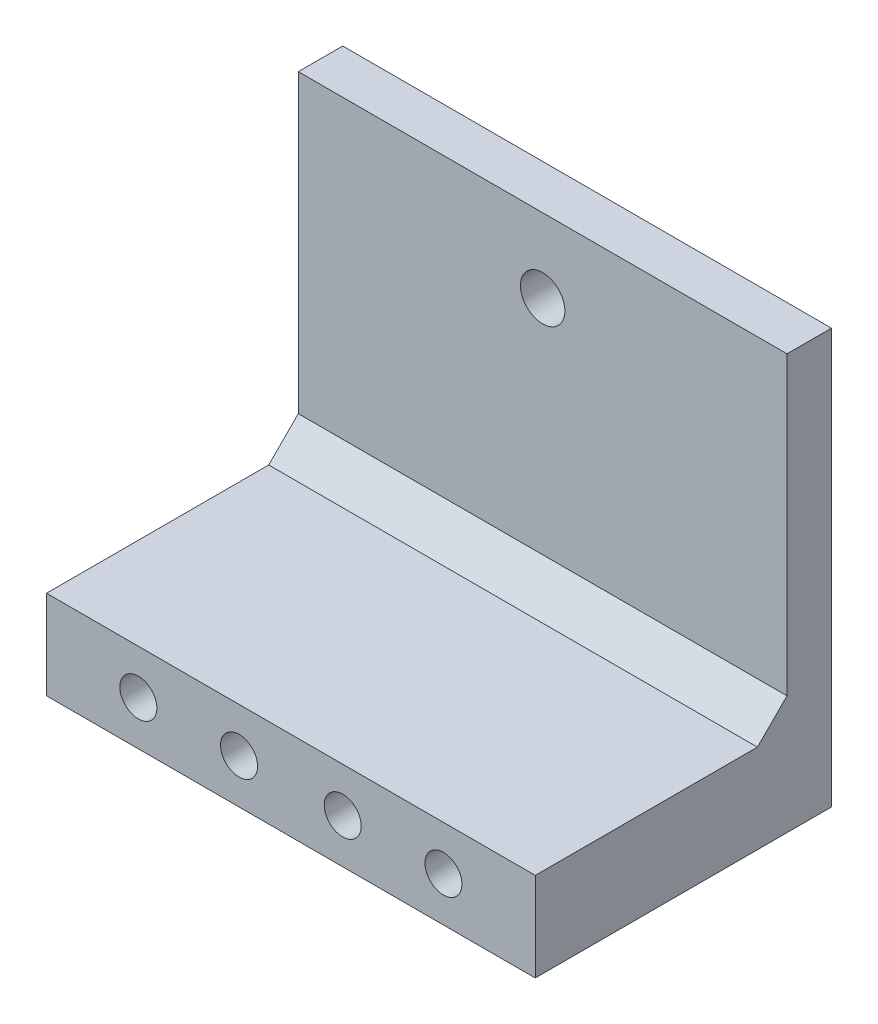
ISO-10303-21;
HEADER;
FILE_DESCRIPTION(('STEP AP214'),'2;1');
FILE_NAME('part.step','',(''),(''),'','','');
FILE_SCHEMA(('AUTOMOTIVE_DESIGN { 1 0 10303 214 1 1 1 1 }'));
ENDSEC;
DATA;
#1=APPLICATION_CONTEXT('core data for automotive mechanical design processes');
#2=APPLICATION_PROTOCOL_DEFINITION('international standard','automotive_design',2000,#1);
#3=PRODUCT_CONTEXT('',#1,'mechanical');
#4=PRODUCT('Part','Part','',(#3));
#5=PRODUCT_RELATED_PRODUCT_CATEGORY('part','',(#4));
#6=PRODUCT_DEFINITION_FORMATION('','',#4);
#7=PRODUCT_DEFINITION_CONTEXT('part definition',#1,'design');
#8=PRODUCT_DEFINITION('design','',#6,#7);
#9=PRODUCT_DEFINITION_SHAPE('','',#8);
#10=(LENGTH_UNIT() NAMED_UNIT(*) SI_UNIT(.MILLI.,.METRE.));
#11=(NAMED_UNIT(*) PLANE_ANGLE_UNIT() SI_UNIT($,.RADIAN.));
#12=(NAMED_UNIT(*) SI_UNIT($,.STERADIAN.) SOLID_ANGLE_UNIT());
#13=UNCERTAINTY_MEASURE_WITH_UNIT(LENGTH_MEASURE(1.E-05),#10,'distance_accuracy_value','');
#14=(GEOMETRIC_REPRESENTATION_CONTEXT(3) GLOBAL_UNCERTAINTY_ASSIGNED_CONTEXT((#13)) GLOBAL_UNIT_ASSIGNED_CONTEXT((#10,
#11,#12)) REPRESENTATION_CONTEXT('',''));
#15=CARTESIAN_POINT('',(0.,0.,0.));
#16=DIRECTION('',(0.,0.,1.));
#17=DIRECTION('',(1.,0.,0.));
#18=AXIS2_PLACEMENT_3D('',#15,#16,#17);
#19=CARTESIAN_POINT('',(0.,32.669809041861,-21.));
#20=DIRECTION('',(0.,-0.707106781186551,-0.707106781186544));
#21=DIRECTION('',(0.,0.707106781186544,-0.707106781186551));
#22=AXIS2_PLACEMENT_3D('',#19,#20,#21);
#23=PLANE('',#22);
#24=DIRECTION('',(-1.,0.,0.));
#25=VECTOR('',#24,1.);
#26=CARTESIAN_POINT('',(0.,32.669809041861,-21.));
#27=LINE('',#26,#25);
#28=CARTESIAN_POINT('',(-6.41211280138837,32.669809041861,-21.));
#29=VERTEX_POINT('',#28);
#30=CARTESIAN_POINT('',(-39.4121128013917,32.669809041861,-21.));
#31=VERTEX_POINT('',#30);
#32=EDGE_CURVE('E11',#29,#31,#27,.T.);
#33=ORIENTED_EDGE('',*,*,#32,.F.);
#34=DIRECTION('',(0.,0.707106781182111,-0.707106781190984));
#35=VECTOR('',#34,1.);
#36=CARTESIAN_POINT('',(-6.41211280139165,32.669809041861,-21.));
#37=LINE('',#36,#35);
#38=CARTESIAN_POINT('',(-6.41211280139165,34.669809041836,-23.));
#39=VERTEX_POINT('',#38);
#40=EDGE_CURVE('E171',#29,#39,#37,.T.);
#41=ORIENTED_EDGE('',*,*,#40,.T.);
#42=DIRECTION('',(1.,0.,0.));
#43=VECTOR('',#42,1.);
#44=CARTESIAN_POINT('',(0.,34.6698090418611,-23.));
#45=LINE('',#44,#43);
#46=CARTESIAN_POINT('',(-39.4121128013153,34.669809041836,-23.));
#47=VERTEX_POINT('',#46);
#48=EDGE_CURVE('E160',#47,#39,#45,.T.);
#49=ORIENTED_EDGE('',*,*,#48,.F.);
#50=DIRECTION('',(0.,0.707106781182111,-0.707106781190984));
#51=VECTOR('',#50,1.);
#52=CARTESIAN_POINT('',(-39.4121128013917,32.669809041861,-21.));
#53=LINE('',#52,#51);
#54=EDGE_CURVE('E133',#31,#47,#53,.T.);
#55=ORIENTED_EDGE('',*,*,#54,.F.);
#56=EDGE_LOOP('',(#33,#41,#49,#55));
#57=FACE_BOUND('',#56,.T.);
#58=ADVANCED_FACE('F17',(#57),#23,.F.);
#59=CARTESIAN_POINT('',(0.,32.669809041861,0.));
#60=DIRECTION('',(0.,1.,0.));
#61=DIRECTION('',(1.,0.,0.));
#62=AXIS2_PLACEMENT_3D('',#59,#60,#61);
#63=PLANE('',#62);
#64=ORIENTED_EDGE('',*,*,#32,.T.);
#65=DIRECTION('',(0.,0.,1.));
#66=VECTOR('',#65,1.);
#67=CARTESIAN_POINT('',(-39.4121128013917,32.669809041861,-25.));
#68=LINE('',#67,#66);
#69=CARTESIAN_POINT('',(-39.4121128013917,32.669809041861,-6.));
#70=VERTEX_POINT('',#69);
#71=EDGE_CURVE('E152',#31,#70,#68,.T.);
#72=ORIENTED_EDGE('',*,*,#71,.T.);
#73=DIRECTION('',(1.,0.,0.));
#74=VECTOR('',#73,1.);
#75=CARTESIAN_POINT('',(-39.4121128013917,32.669809041861,-6.));
#76=LINE('',#75,#74);
#77=CARTESIAN_POINT('',(-6.41211280138837,32.669809041861,-6.));
#78=VERTEX_POINT('',#77);
#79=EDGE_CURVE('E26',#70,#78,#76,.T.);
#80=ORIENTED_EDGE('',*,*,#79,.T.);
#81=DIRECTION('',(0.,0.,1.));
#82=VECTOR('',#81,1.);
#83=CARTESIAN_POINT('',(-6.41211280138837,32.669809041861,-25.));
#84=LINE('',#83,#82);
#85=EDGE_CURVE('E127',#29,#78,#84,.T.);
#86=ORIENTED_EDGE('',*,*,#85,.F.);
#87=EDGE_LOOP('',(#64,#72,#80,#86));
#88=FACE_BOUND('',#87,.T.);
#89=ADVANCED_FACE('F19',(#88),#63,.T.);
#90=CARTESIAN_POINT('',(-6.41211280139167,-16.8302017820798,-6.));
#91=DIRECTION('',(0.,0.,1.));
#92=DIRECTION('',(0.,-1.,0.));
#93=AXIS2_PLACEMENT_3D('',#90,#91,#92);
#94=PLANE('',#93);
#95=CARTESIAN_POINT('',(-33.2121128013917,29.6698090418937,-6.));
#96=DIRECTION('',(0.,0.,-1.));
#97=DIRECTION('',(0.,-1.,0.));
#98=AXIS2_PLACEMENT_3D('',#95,#96,#97);
#99=CIRCLE('',#98,1.25);
#100=CARTESIAN_POINT('',(-33.2121128013917,28.4198090418937,-6.));
#101=VERTEX_POINT('',#100);
#102=EDGE_CURVE('E185',#101,#101,#99,.T.);
#103=ORIENTED_EDGE('',*,*,#102,.T.);
#104=EDGE_LOOP('',(#103));
#105=FACE_BOUND('',#104,.T.);
#106=CARTESIAN_POINT('',(-12.612112801392,29.6698090418937,-6.));
#107=DIRECTION('',(0.,0.,-1.));
#108=DIRECTION('',(0.,-1.,0.));
#109=AXIS2_PLACEMENT_3D('',#106,#107,#108);
#110=CIRCLE('',#109,1.25);
#111=CARTESIAN_POINT('',(-12.612112801392,28.4198090418937,-6.));
#112=VERTEX_POINT('',#111);
#113=EDGE_CURVE('E195',#112,#112,#110,.T.);
#114=ORIENTED_EDGE('',*,*,#113,.T.);
#115=EDGE_LOOP('',(#114));
#116=FACE_BOUND('',#115,.T.);
#117=CARTESIAN_POINT('',(-26.4121128013917,29.6698090418937,-6.));
#118=DIRECTION('',(0.,0.,-1.));
#119=DIRECTION('',(0.,-1.,0.));
#120=AXIS2_PLACEMENT_3D('',#117,#118,#119);
#121=CIRCLE('',#120,1.25);
#122=CARTESIAN_POINT('',(-26.4121128013917,28.4198090418937,-6.));
#123=VERTEX_POINT('',#122);
#124=EDGE_CURVE('E200',#123,#123,#121,.T.);
#125=ORIENTED_EDGE('',*,*,#124,.T.);
#126=EDGE_LOOP('',(#125));
#127=FACE_BOUND('',#126,.T.);
#128=CARTESIAN_POINT('',(-19.4121128013917,29.6698090418937,-6.));
#129=DIRECTION('',(0.,0.,-1.));
#130=DIRECTION('',(0.,-1.,0.));
#131=AXIS2_PLACEMENT_3D('',#128,#129,#130);
#132=CIRCLE('',#131,1.25);
#133=CARTESIAN_POINT('',(-19.4121128013917,28.4198090418937,-6.));
#134=VERTEX_POINT('',#133);
#135=EDGE_CURVE('E211',#134,#134,#132,.T.);
#136=ORIENTED_EDGE('',*,*,#135,.T.);
#137=EDGE_LOOP('',(#136));
#138=FACE_BOUND('',#137,.T.);
#139=ORIENTED_EDGE('',*,*,#79,.F.);
#140=DIRECTION('',(0.,1.,0.));
#141=VECTOR('',#140,1.);
#142=CARTESIAN_POINT('',(-39.4121128013917,-16.8302017820798,-6.));
#143=LINE('',#142,#141);
#144=CARTESIAN_POINT('',(-39.4121128013917,26.6698090416414,-6.));
#145=VERTEX_POINT('',#144);
#146=EDGE_CURVE('E148',#145,#70,#143,.T.);
#147=ORIENTED_EDGE('',*,*,#146,.F.);
#148=DIRECTION('',(-1.,0.,0.));
#149=VECTOR('',#148,1.);
#150=CARTESIAN_POINT('',(0.,26.6698090416414,-6.));
#151=LINE('',#150,#149);
#152=CARTESIAN_POINT('',(-6.41211280139167,26.6698090416413,-6.));
#153=VERTEX_POINT('',#152);
#154=EDGE_CURVE('E49',#153,#145,#151,.T.);
#155=ORIENTED_EDGE('',*,*,#154,.F.);
#156=DIRECTION('',(0.,1.,0.));
#157=VECTOR('',#156,1.);
#158=CARTESIAN_POINT('',(-6.41211280139167,-16.8302017820798,-6.));
#159=LINE('',#158,#157);
#160=EDGE_CURVE('E121',#153,#78,#159,.T.);
#161=ORIENTED_EDGE('',*,*,#160,.T.);
#162=EDGE_LOOP('',(#139,#147,#155,#161));
#163=FACE_BOUND('',#162,.T.);
#164=ADVANCED_FACE('F169',(#105,#116,#127,#138,#163),#94,.T.);
#165=CARTESIAN_POINT('',(0.,0.,-23.));
#166=DIRECTION('',(0.,0.,-1.));
#167=DIRECTION('',(0.,-1.,0.));
#168=AXIS2_PLACEMENT_3D('',#165,#166,#167);
#169=PLANE('',#168);
#170=CARTESIAN_POINT('',(-22.9121128013917,49.6698090418938,-23.));
#171=DIRECTION('',(0.,0.,1.));
#172=DIRECTION('',(-1.,0.,0.));
#173=AXIS2_PLACEMENT_3D('',#170,#171,#172);
#174=CIRCLE('',#173,1.5);
#175=CARTESIAN_POINT('',(-24.4121128013917,49.6698090418938,-23.));
#176=VERTEX_POINT('',#175);
#177=EDGE_CURVE('E221',#176,#176,#174,.T.);
#178=ORIENTED_EDGE('',*,*,#177,.F.);
#179=EDGE_LOOP('',(#178));
#180=FACE_BOUND('',#179,.T.);
#181=DIRECTION('',(0.,1.,0.));
#182=VECTOR('',#181,1.);
#183=CARTESIAN_POINT('',(-39.4121128013153,31.669809041861,-23.));
#184=LINE('',#183,#182);
#185=CARTESIAN_POINT('',(-39.4121128013153,54.6698090418938,-23.));
#186=VERTEX_POINT('',#185);
#187=EDGE_CURVE('E137',#47,#186,#184,.T.);
#188=ORIENTED_EDGE('',*,*,#187,.F.);
#189=ORIENTED_EDGE('',*,*,#48,.T.);
#190=DIRECTION('',(0.,-1.,0.));
#191=VECTOR('',#190,1.);
#192=CARTESIAN_POINT('',(-6.41211280139167,31.669809041861,-23.));
#193=LINE('',#192,#191);
#194=CARTESIAN_POINT('',(-6.41211280139167,54.6698090418938,-23.));
#195=VERTEX_POINT('',#194);
#196=EDGE_CURVE('E177',#195,#39,#193,.T.);
#197=ORIENTED_EDGE('',*,*,#196,.F.);
#198=DIRECTION('',(1.,0.,0.));
#199=VECTOR('',#198,1.);
#200=CARTESIAN_POINT('',(0.,54.6698090418938,-23.));
#201=LINE('',#200,#199);
#202=EDGE_CURVE('E155',#186,#195,#201,.T.);
#203=ORIENTED_EDGE('',*,*,#202,.F.);
#204=EDGE_LOOP('',(#188,#189,#197,#203));
#205=FACE_BOUND('',#204,.T.);
#206=ADVANCED_FACE('F230',(#180,#205),#169,.F.);
#207=CARTESIAN_POINT('',(0.,54.6698090418938,-23.));
#208=DIRECTION('',(0.,1.,0.));
#209=DIRECTION('',(1.,0.,0.));
#210=AXIS2_PLACEMENT_3D('',#207,#208,#209);
#211=PLANE('',#210);
#212=DIRECTION('',(1.,0.,0.));
#213=VECTOR('',#212,1.);
#214=CARTESIAN_POINT('',(0.,54.6698090418938,-26.));
#215=LINE('',#214,#213);
#216=CARTESIAN_POINT('',(-39.4121128013153,54.6698090418938,-26.));
#217=VERTEX_POINT('',#216);
#218=CARTESIAN_POINT('',(-6.41211280139167,54.6698090418938,-26.));
#219=VERTEX_POINT('',#218);
#220=EDGE_CURVE('E107',#217,#219,#215,.T.);
#221=ORIENTED_EDGE('',*,*,#220,.F.);
#222=DIRECTION('',(0.,0.,-1.));
#223=VECTOR('',#222,1.);
#224=CARTESIAN_POINT('',(-39.4121128013153,54.6698090418938,-23.));
#225=LINE('',#224,#223);
#226=EDGE_CURVE('E141',#186,#217,#225,.T.);
#227=ORIENTED_EDGE('',*,*,#226,.F.);
#228=ORIENTED_EDGE('',*,*,#202,.T.);
#229=DIRECTION('',(0.,0.,-1.));
#230=VECTOR('',#229,1.);
#231=CARTESIAN_POINT('',(-6.41211280139167,54.6698090418938,-23.));
#232=LINE('',#231,#230);
#233=EDGE_CURVE('E116',#195,#219,#232,.T.);
#234=ORIENTED_EDGE('',*,*,#233,.T.);
#235=EDGE_LOOP('',(#221,#227,#228,#234));
#236=FACE_BOUND('',#235,.T.);
#237=ADVANCED_FACE('F233',(#236),#211,.T.);
#238=CARTESIAN_POINT('',(0.,0.,-26.));
#239=DIRECTION('',(0.,0.,1.));
#240=DIRECTION('',(1.,0.,0.));
#241=AXIS2_PLACEMENT_3D('',#238,#239,#240);
#242=PLANE('',#241);
#243=CARTESIAN_POINT('',(-12.612112801392,29.6698090418937,-26.));
#244=DIRECTION('',(0.,0.,-1.));
#245=DIRECTION('',(-1.,0.,0.));
#246=AXIS2_PLACEMENT_3D('',#243,#244,#245);
#247=CIRCLE('',#246,1.25);
#248=CARTESIAN_POINT('',(-13.862112801392,29.6698090418937,-26.));
#249=VERTEX_POINT('',#248);
#250=EDGE_CURVE('E189',#249,#249,#247,.T.);
#251=ORIENTED_EDGE('',*,*,#250,.F.);
#252=EDGE_LOOP('',(#251));
#253=FACE_BOUND('',#252,.T.);
#254=CARTESIAN_POINT('',(-33.2121128013917,29.6698090418937,-26.));
#255=DIRECTION('',(0.,0.,-1.));
#256=DIRECTION('',(-1.,0.,0.));
#257=AXIS2_PLACEMENT_3D('',#254,#255,#256);
#258=CIRCLE('',#257,1.25);
#259=CARTESIAN_POINT('',(-34.4621128013917,29.6698090418937,-26.));
#260=VERTEX_POINT('',#259);
#261=EDGE_CURVE('E181',#260,#260,#258,.T.);
#262=ORIENTED_EDGE('',*,*,#261,.F.);
#263=EDGE_LOOP('',(#262));
#264=FACE_BOUND('',#263,.T.);
#265=CARTESIAN_POINT('',(-22.9121128013917,49.6698090418938,-26.));
#266=DIRECTION('',(0.,0.,-1.));
#267=DIRECTION('',(-1.,0.,0.));
#268=AXIS2_PLACEMENT_3D('',#265,#266,#267);
#269=CIRCLE('',#268,1.5);
#270=CARTESIAN_POINT('',(-24.4121128013917,49.6698090418938,-26.));
#271=VERTEX_POINT('',#270);
#272=EDGE_CURVE('E217',#271,#271,#269,.T.);
#273=ORIENTED_EDGE('',*,*,#272,.F.);
#274=EDGE_LOOP('',(#273));
#275=FACE_BOUND('',#274,.T.);
#276=CARTESIAN_POINT('',(-26.4121128013917,29.6698090418937,-26.));
#277=DIRECTION('',(0.,0.,-1.));
#278=DIRECTION('',(-1.,0.,0.));
#279=AXIS2_PLACEMENT_3D('',#276,#277,#278);
#280=CIRCLE('',#279,1.25);
#281=CARTESIAN_POINT('',(-27.6621128013917,29.6698090418937,-26.));
#282=VERTEX_POINT('',#281);
#283=EDGE_CURVE('E196',#282,#282,#280,.T.);
#284=ORIENTED_EDGE('',*,*,#283,.F.);
#285=EDGE_LOOP('',(#284));
#286=FACE_BOUND('',#285,.T.);
#287=CARTESIAN_POINT('',(-19.4121128013917,29.6698090418937,-26.));
#288=DIRECTION('',(0.,0.,-1.));
#289=DIRECTION('',(-1.,0.,0.));
#290=AXIS2_PLACEMENT_3D('',#287,#288,#289);
#291=CIRCLE('',#290,1.25);
#292=CARTESIAN_POINT('',(-20.6621128013917,29.6698090418937,-26.));
#293=VERTEX_POINT('',#292);
#294=EDGE_CURVE('E204',#293,#293,#291,.T.);
#295=ORIENTED_EDGE('',*,*,#294,.F.);
#296=EDGE_LOOP('',(#295));
#297=FACE_BOUND('',#296,.T.);
#298=DIRECTION('',(0.,1.,0.));
#299=VECTOR('',#298,1.);
#300=CARTESIAN_POINT('',(-6.41211280139167,27.6698090416414,-26.));
#301=LINE('',#300,#299);
#302=CARTESIAN_POINT('',(-6.41211280139167,26.6698090416414,-26.));
#303=VERTEX_POINT('',#302);
#304=EDGE_CURVE('E110',#303,#219,#301,.T.);
#305=ORIENTED_EDGE('',*,*,#304,.F.);
#306=DIRECTION('',(1.,0.,0.));
#307=VECTOR('',#306,1.);
#308=CARTESIAN_POINT('',(0.,26.6698090416414,-26.));
#309=LINE('',#308,#307);
#310=CARTESIAN_POINT('',(-39.4121128013917,26.6698090416414,-26.));
#311=VERTEX_POINT('',#310);
#312=EDGE_CURVE('E95',#311,#303,#309,.T.);
#313=ORIENTED_EDGE('',*,*,#312,.F.);
#314=DIRECTION('',(0.,-1.,0.));
#315=VECTOR('',#314,1.);
#316=CARTESIAN_POINT('',(-39.4121128013917,31.669809041861,-26.));
#317=LINE('',#316,#315);
#318=EDGE_CURVE('E145',#217,#311,#317,.T.);
#319=ORIENTED_EDGE('',*,*,#318,.F.);
#320=ORIENTED_EDGE('',*,*,#220,.T.);
#321=EDGE_LOOP('',(#305,#313,#319,#320));
#322=FACE_BOUND('',#321,.T.);
#323=ADVANCED_FACE('F111',(#253,#264,#275,#286,#297,#322),#242,.F.);
#324=CARTESIAN_POINT('',(0.,26.6698090416414,0.));
#325=DIRECTION('',(0.,-1.,0.));
#326=DIRECTION('',(0.,0.,-1.));
#327=AXIS2_PLACEMENT_3D('',#324,#325,#326);
#328=PLANE('',#327);
#329=DIRECTION('',(0.,0.,1.));
#330=VECTOR('',#329,1.);
#331=CARTESIAN_POINT('',(-6.41211280139167,26.6698090416414,0.));
#332=LINE('',#331,#330);
#333=EDGE_CURVE('E99',#303,#153,#332,.T.);
#334=ORIENTED_EDGE('',*,*,#333,.T.);
#335=ORIENTED_EDGE('',*,*,#154,.T.);
#336=DIRECTION('',(0.,0.,-1.));
#337=VECTOR('',#336,1.);
#338=CARTESIAN_POINT('',(-39.4121128013917,26.6698090416414,0.));
#339=LINE('',#338,#337);
#340=EDGE_CURVE('E102',#145,#311,#339,.T.);
#341=ORIENTED_EDGE('',*,*,#340,.T.);
#342=ORIENTED_EDGE('',*,*,#312,.T.);
#343=EDGE_LOOP('',(#334,#335,#341,#342));
#344=FACE_BOUND('',#343,.T.);
#345=ADVANCED_FACE('F97',(#344),#328,.T.);
#346=CARTESIAN_POINT('',(-39.4121128013917,0.,0.));
#347=DIRECTION('',(1.,0.,0.));
#348=DIRECTION('',(0.,1.,0.));
#349=AXIS2_PLACEMENT_3D('',#346,#347,#348);
#350=PLANE('',#349);
#351=ORIENTED_EDGE('',*,*,#54,.T.);
#352=ORIENTED_EDGE('',*,*,#187,.T.);
#353=ORIENTED_EDGE('',*,*,#226,.T.);
#354=ORIENTED_EDGE('',*,*,#318,.T.);
#355=ORIENTED_EDGE('',*,*,#340,.F.);
#356=ORIENTED_EDGE('',*,*,#146,.T.);
#357=ORIENTED_EDGE('',*,*,#71,.F.);
#358=EDGE_LOOP('',(#351,#352,#353,#354,#355,#356,#357));
#359=FACE_BOUND('',#358,.T.);
#360=ADVANCED_FACE('F240',(#359),#350,.F.);
#361=CARTESIAN_POINT('',(-6.41211280139168,0.,0.));
#362=DIRECTION('',(1.,0.,0.));
#363=DIRECTION('',(0.,1.,0.));
#364=AXIS2_PLACEMENT_3D('',#361,#362,#363);
#365=PLANE('',#364);
#366=ORIENTED_EDGE('',*,*,#196,.T.);
#367=ORIENTED_EDGE('',*,*,#40,.F.);
#368=ORIENTED_EDGE('',*,*,#85,.T.);
#369=ORIENTED_EDGE('',*,*,#160,.F.);
#370=ORIENTED_EDGE('',*,*,#333,.F.);
#371=ORIENTED_EDGE('',*,*,#304,.T.);
#372=ORIENTED_EDGE('',*,*,#233,.F.);
#373=EDGE_LOOP('',(#366,#367,#368,#369,#370,#371,#372));
#374=FACE_BOUND('',#373,.T.);
#375=ADVANCED_FACE('F119',(#374),#365,.T.);
#376=CARTESIAN_POINT('',(-33.2121128013917,29.6698090418937,-13.898780669118));
#377=DIRECTION('',(0.,0.,-1.));
#378=DIRECTION('',(-1.,0.,0.));
#379=AXIS2_PLACEMENT_3D('',#376,#377,#378);
#380=CYLINDRICAL_SURFACE('',#379,1.25);
#381=ORIENTED_EDGE('',*,*,#261,.T.);
#382=EDGE_LOOP('',(#381));
#383=FACE_BOUND('',#382,.T.);
#384=ORIENTED_EDGE('',*,*,#102,.F.);
#385=EDGE_LOOP('',(#384));
#386=FACE_BOUND('',#385,.T.);
#387=ADVANCED_FACE('F263',(#383,#386),#380,.F.);
#388=CARTESIAN_POINT('',(-12.612112801392,29.6698090418937,-13.898780669118));
#389=DIRECTION('',(0.,0.,-1.));
#390=DIRECTION('',(-1.,0.,0.));
#391=AXIS2_PLACEMENT_3D('',#388,#389,#390);
#392=CYLINDRICAL_SURFACE('',#391,1.25);
#393=ORIENTED_EDGE('',*,*,#250,.T.);
#394=EDGE_LOOP('',(#393));
#395=FACE_BOUND('',#394,.T.);
#396=ORIENTED_EDGE('',*,*,#113,.F.);
#397=EDGE_LOOP('',(#396));
#398=FACE_BOUND('',#397,.T.);
#399=ADVANCED_FACE('F264',(#395,#398),#392,.F.);
#400=CARTESIAN_POINT('',(-26.4121128013917,29.6698090418937,6.3));
#401=DIRECTION('',(0.,0.,-1.));
#402=DIRECTION('',(-1.,0.,0.));
#403=AXIS2_PLACEMENT_3D('',#400,#401,#402);
#404=CYLINDRICAL_SURFACE('',#403,1.25);
#405=ORIENTED_EDGE('',*,*,#283,.T.);
#406=EDGE_LOOP('',(#405));
#407=FACE_BOUND('',#406,.T.);
#408=ORIENTED_EDGE('',*,*,#124,.F.);
#409=EDGE_LOOP('',(#408));
#410=FACE_BOUND('',#409,.T.);
#411=ADVANCED_FACE('F267',(#407,#410),#404,.F.);
#412=CARTESIAN_POINT('',(-19.4121128013917,29.6698090418937,6.3));
#413=DIRECTION('',(0.,0.,-1.));
#414=DIRECTION('',(-1.,0.,0.));
#415=AXIS2_PLACEMENT_3D('',#412,#413,#414);
#416=CYLINDRICAL_SURFACE('',#415,1.25);
#417=ORIENTED_EDGE('',*,*,#294,.T.);
#418=EDGE_LOOP('',(#417));
#419=FACE_BOUND('',#418,.T.);
#420=ORIENTED_EDGE('',*,*,#135,.F.);
#421=EDGE_LOOP('',(#420));
#422=FACE_BOUND('',#421,.T.);
#423=ADVANCED_FACE('F274',(#419,#422),#416,.F.);
#424=CARTESIAN_POINT('',(-22.9121128013917,49.6698090418938,9.901));
#425=DIRECTION('',(0.,0.,-1.));
#426=DIRECTION('',(-1.,0.,0.));
#427=AXIS2_PLACEMENT_3D('',#424,#425,#426);
#428=CYLINDRICAL_SURFACE('',#427,1.5);
#429=ORIENTED_EDGE('',*,*,#272,.T.);
#430=EDGE_LOOP('',(#429));
#431=FACE_BOUND('',#430,.T.);
#432=ORIENTED_EDGE('',*,*,#177,.T.);
#433=EDGE_LOOP('',(#432));
#434=FACE_BOUND('',#433,.T.);
#435=ADVANCED_FACE('F228',(#431,#434),#428,.F.);
#436=CLOSED_SHELL('',(#58,#89,#164,#206,#237,#323,#345,#360,#375,#387,#399,#411,#423,#435));
#437=MANIFOLD_SOLID_BREP('B1',#436);
#438=ADVANCED_BREP_SHAPE_REPRESENTATION('',(#18,#437),#14);
#439=SHAPE_DEFINITION_REPRESENTATION(#9,#438);
ENDSEC;
END-ISO-10303-21;
